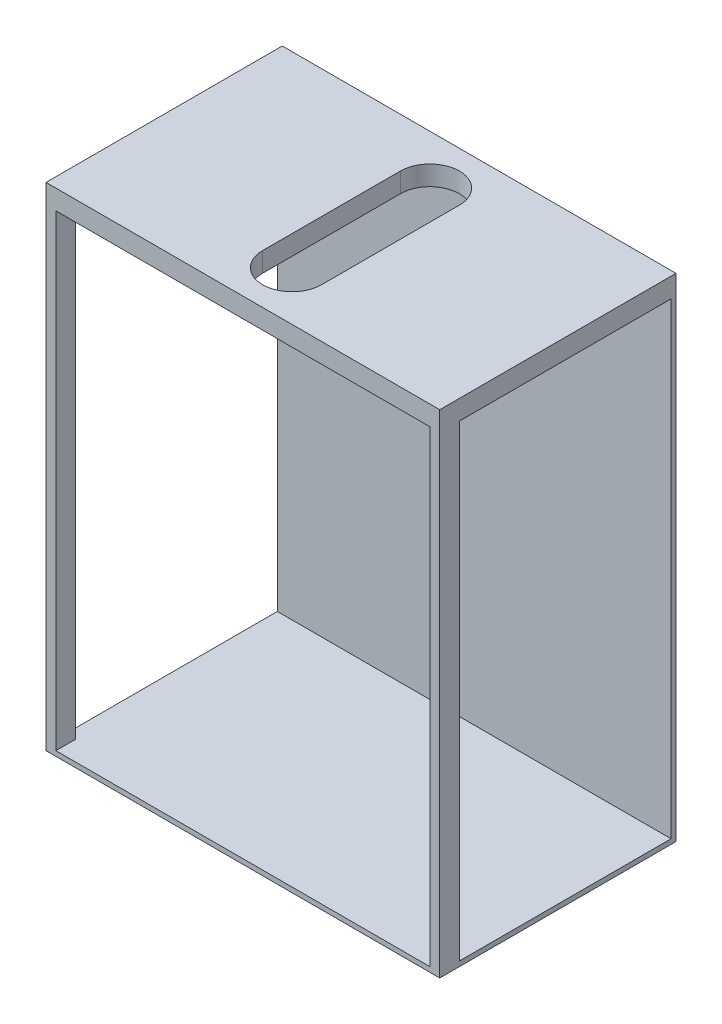
ISO-10303-21;
HEADER;
FILE_DESCRIPTION(('STEP AP214'),'2;1');
FILE_NAME('part.step','',(''),(''),'','','');
FILE_SCHEMA(('AUTOMOTIVE_DESIGN { 1 0 10303 214 1 1 1 1 }'));
ENDSEC;
DATA;
#1=APPLICATION_CONTEXT('core data for automotive mechanical design processes');
#2=APPLICATION_PROTOCOL_DEFINITION('international standard','automotive_design',2000,#1);
#3=PRODUCT_CONTEXT('',#1,'mechanical');
#4=PRODUCT('Part','Part','',(#3));
#5=PRODUCT_RELATED_PRODUCT_CATEGORY('part','',(#4));
#6=PRODUCT_DEFINITION_FORMATION('','',#4);
#7=PRODUCT_DEFINITION_CONTEXT('part definition',#1,'design');
#8=PRODUCT_DEFINITION('design','',#6,#7);
#9=PRODUCT_DEFINITION_SHAPE('','',#8);
#10=(LENGTH_UNIT() NAMED_UNIT(*) SI_UNIT(.MILLI.,.METRE.));
#11=(NAMED_UNIT(*) PLANE_ANGLE_UNIT() SI_UNIT($,.RADIAN.));
#12=(NAMED_UNIT(*) SI_UNIT($,.STERADIAN.) SOLID_ANGLE_UNIT());
#13=UNCERTAINTY_MEASURE_WITH_UNIT(LENGTH_MEASURE(1.E-05),#10,'distance_accuracy_value','');
#14=(GEOMETRIC_REPRESENTATION_CONTEXT(3) GLOBAL_UNCERTAINTY_ASSIGNED_CONTEXT((#13)) GLOBAL_UNIT_ASSIGNED_CONTEXT((#10,
#11,#12)) REPRESENTATION_CONTEXT('',''));
#15=CARTESIAN_POINT('',(0.,0.,0.));
#16=DIRECTION('',(0.,0.,1.));
#17=DIRECTION('',(1.,0.,0.));
#18=AXIS2_PLACEMENT_3D('',#15,#16,#17);
#19=CARTESIAN_POINT('',(0.,0.,6.35));
#20=DIRECTION('',(0.,0.,-1.));
#21=DIRECTION('',(-1.,0.,0.));
#22=AXIS2_PLACEMENT_3D('',#19,#20,#21);
#23=PLANE('',#22);
#24=DIRECTION('',(0.,1.,0.));
#25=VECTOR('',#24,1.);
#26=CARTESIAN_POINT('',(508.,0.,6.35));
#27=LINE('',#26,#25);
#28=CARTESIAN_POINT('',(508.,6.35,6.35));
#29=VERTEX_POINT('',#28);
#30=CARTESIAN_POINT('',(508.,609.6,6.35));
#31=VERTEX_POINT('',#30);
#32=EDGE_CURVE('E292',#29,#31,#27,.T.);
#33=ORIENTED_EDGE('',*,*,#32,.T.);
#34=DIRECTION('',(-1.,0.,0.));
#35=VECTOR('',#34,1.);
#36=CARTESIAN_POINT('',(12.7,609.6,6.35));
#37=LINE('',#36,#35);
#38=CARTESIAN_POINT('',(0.,609.6,6.35));
#39=VERTEX_POINT('',#38);
#40=EDGE_CURVE('E251',#31,#39,#37,.T.);
#41=ORIENTED_EDGE('',*,*,#40,.T.);
#42=DIRECTION('',(0.,-1.,0.));
#43=VECTOR('',#42,1.);
#44=CARTESIAN_POINT('',(0.,0.,6.35));
#45=LINE('',#44,#43);
#46=CARTESIAN_POINT('',(0.,6.35,6.35));
#47=VERTEX_POINT('',#46);
#48=EDGE_CURVE('E289',#39,#47,#45,.T.);
#49=ORIENTED_EDGE('',*,*,#48,.T.);
#50=DIRECTION('',(-1.,0.,0.));
#51=VECTOR('',#50,1.);
#52=CARTESIAN_POINT('',(0.,6.35,6.35));
#53=LINE('',#52,#51);
#54=EDGE_CURVE('E273',#29,#47,#53,.T.);
#55=ORIENTED_EDGE('',*,*,#54,.F.);
#56=EDGE_LOOP('',(#33,#41,#49,#55));
#57=FACE_BOUND('',#56,.T.);
#58=ADVANCED_FACE('F43',(#57),#23,.F.);
#59=CARTESIAN_POINT('',(12.7,0.,0.));
#60=DIRECTION('',(-1.,0.,0.));
#61=DIRECTION('',(0.,0.,1.));
#62=AXIS2_PLACEMENT_3D('',#59,#60,#61);
#63=PLANE('',#62);
#64=DIRECTION('',(0.,0.,-1.));
#65=VECTOR('',#64,1.);
#66=CARTESIAN_POINT('',(12.7,609.6,304.8));
#67=LINE('',#66,#65);
#68=CARTESIAN_POINT('',(12.7,609.6,304.8));
#69=VERTEX_POINT('',#68);
#70=CARTESIAN_POINT('',(12.7,609.6,279.4));
#71=VERTEX_POINT('',#70);
#72=EDGE_CURVE('E197',#69,#71,#67,.T.);
#73=ORIENTED_EDGE('',*,*,#72,.F.);
#74=DIRECTION('',(0.,-1.,0.));
#75=VECTOR('',#74,1.);
#76=CARTESIAN_POINT('',(12.7,6.35,304.8));
#77=LINE('',#76,#75);
#78=CARTESIAN_POINT('',(12.7,6.35,304.8));
#79=VERTEX_POINT('',#78);
#80=EDGE_CURVE('E239',#69,#79,#77,.T.);
#81=ORIENTED_EDGE('',*,*,#80,.T.);
#82=DIRECTION('',(0.,0.,-1.));
#83=VECTOR('',#82,1.);
#84=CARTESIAN_POINT('',(12.7,6.34999999999997,279.4));
#85=LINE('',#84,#83);
#86=CARTESIAN_POINT('',(12.7,6.35,279.4));
#87=VERTEX_POINT('',#86);
#88=EDGE_CURVE('E230',#79,#87,#85,.T.);
#89=ORIENTED_EDGE('',*,*,#88,.T.);
#90=DIRECTION('',(0.,1.,0.));
#91=VECTOR('',#90,1.);
#92=CARTESIAN_POINT('',(12.7,609.6,279.4));
#93=LINE('',#92,#91);
#94=EDGE_CURVE('E234',#87,#71,#93,.T.);
#95=ORIENTED_EDGE('',*,*,#94,.T.);
#96=EDGE_LOOP('',(#73,#81,#89,#95));
#97=FACE_BOUND('',#96,.T.);
#98=ADVANCED_FACE('F343',(#97),#63,.F.);
#99=CARTESIAN_POINT('',(495.3,0.,0.));
#100=DIRECTION('',(1.,0.,0.));
#101=DIRECTION('',(0.,0.,1.));
#102=AXIS2_PLACEMENT_3D('',#99,#100,#101);
#103=PLANE('',#102);
#104=DIRECTION('',(0.,0.,-1.));
#105=VECTOR('',#104,1.);
#106=CARTESIAN_POINT('',(495.3,609.6,304.8));
#107=LINE('',#106,#105);
#108=CARTESIAN_POINT('',(495.3,609.6,304.8));
#109=VERTEX_POINT('',#108);
#110=CARTESIAN_POINT('',(495.3,609.6,279.4));
#111=VERTEX_POINT('',#110);
#112=EDGE_CURVE('E200',#109,#111,#107,.T.);
#113=ORIENTED_EDGE('',*,*,#112,.T.);
#114=DIRECTION('',(0.,1.,0.));
#115=VECTOR('',#114,1.);
#116=CARTESIAN_POINT('',(495.3,609.6,279.4));
#117=LINE('',#116,#115);
#118=CARTESIAN_POINT('',(495.3,6.35,279.4));
#119=VERTEX_POINT('',#118);
#120=EDGE_CURVE('E213',#119,#111,#117,.T.);
#121=ORIENTED_EDGE('',*,*,#120,.F.);
#122=DIRECTION('',(0.,0.,-1.));
#123=VECTOR('',#122,1.);
#124=CARTESIAN_POINT('',(495.3,6.34999999999997,279.4));
#125=LINE('',#124,#123);
#126=CARTESIAN_POINT('',(495.3,6.35,304.8));
#127=VERTEX_POINT('',#126);
#128=EDGE_CURVE('E206',#127,#119,#125,.T.);
#129=ORIENTED_EDGE('',*,*,#128,.F.);
#130=DIRECTION('',(0.,-1.,0.));
#131=VECTOR('',#130,1.);
#132=CARTESIAN_POINT('',(495.3,6.35,304.8));
#133=LINE('',#132,#131);
#134=EDGE_CURVE('E209',#109,#127,#133,.T.);
#135=ORIENTED_EDGE('',*,*,#134,.F.);
#136=EDGE_LOOP('',(#113,#121,#129,#135));
#137=FACE_BOUND('',#136,.T.);
#138=ADVANCED_FACE('F349',(#137),#103,.F.);
#139=CARTESIAN_POINT('',(0.,6.35,0.));
#140=DIRECTION('',(0.,1.,0.));
#141=DIRECTION('',(0.,0.,1.));
#142=AXIS2_PLACEMENT_3D('',#139,#140,#141);
#143=PLANE('',#142);
#144=DIRECTION('',(1.,0.,0.));
#145=VECTOR('',#144,1.);
#146=CARTESIAN_POINT('',(495.3,6.34999999999997,279.4));
#147=LINE('',#146,#145);
#148=CARTESIAN_POINT('',(508.,6.35,279.4));
#149=VERTEX_POINT('',#148);
#150=EDGE_CURVE('E217',#119,#149,#147,.T.);
#151=ORIENTED_EDGE('',*,*,#150,.T.);
#152=DIRECTION('',(0.,0.,-1.));
#153=VECTOR('',#152,1.);
#154=CARTESIAN_POINT('',(508.,6.35,6.35));
#155=LINE('',#154,#153);
#156=EDGE_CURVE('E270',#149,#29,#155,.T.);
#157=ORIENTED_EDGE('',*,*,#156,.T.);
#158=ORIENTED_EDGE('',*,*,#54,.T.);
#159=DIRECTION('',(0.,0.,1.));
#160=VECTOR('',#159,1.);
#161=CARTESIAN_POINT('',(0.,6.35,6.35));
#162=LINE('',#161,#160);
#163=CARTESIAN_POINT('',(0.,6.35,279.4));
#164=VERTEX_POINT('',#163);
#165=EDGE_CURVE('E263',#47,#164,#162,.T.);
#166=ORIENTED_EDGE('',*,*,#165,.T.);
#167=DIRECTION('',(-1.,0.,0.));
#168=VECTOR('',#167,1.);
#169=CARTESIAN_POINT('',(12.7,6.34999999999997,279.4));
#170=LINE('',#169,#168);
#171=EDGE_CURVE('E258',#87,#164,#170,.T.);
#172=ORIENTED_EDGE('',*,*,#171,.F.);
#173=ORIENTED_EDGE('',*,*,#88,.F.);
#174=DIRECTION('',(1.,0.,0.));
#175=VECTOR('',#174,1.);
#176=CARTESIAN_POINT('',(0.,6.35,304.8));
#177=LINE('',#176,#175);
#178=EDGE_CURVE('E266',#79,#127,#177,.T.);
#179=ORIENTED_EDGE('',*,*,#178,.T.);
#180=ORIENTED_EDGE('',*,*,#128,.T.);
#181=EDGE_LOOP('',(#151,#157,#158,#166,#172,#173,#179,#180));
#182=FACE_BOUND('',#181,.T.);
#183=ADVANCED_FACE('F340',(#182),#143,.T.);
#184=CARTESIAN_POINT('',(0.,0.,6.35));
#185=DIRECTION('',(1.,0.,0.));
#186=DIRECTION('',(0.,0.,-1.));
#187=AXIS2_PLACEMENT_3D('',#184,#185,#186);
#188=PLANE('',#187);
#189=ORIENTED_EDGE('',*,*,#48,.F.);
#190=DIRECTION('',(0.,0.,-1.));
#191=VECTOR('',#190,1.);
#192=CARTESIAN_POINT('',(0.,609.6,6.35));
#193=LINE('',#192,#191);
#194=CARTESIAN_POINT('',(0.,609.6,279.4));
#195=VERTEX_POINT('',#194);
#196=EDGE_CURVE('E235',#195,#39,#193,.T.);
#197=ORIENTED_EDGE('',*,*,#196,.F.);
#198=DIRECTION('',(0.,1.,0.));
#199=VECTOR('',#198,1.);
#200=CARTESIAN_POINT('',(0.,609.6,279.4));
#201=LINE('',#200,#199);
#202=EDGE_CURVE('E229',#164,#195,#201,.T.);
#203=ORIENTED_EDGE('',*,*,#202,.F.);
#204=ORIENTED_EDGE('',*,*,#165,.F.);
#205=EDGE_LOOP('',(#189,#197,#203,#204));
#206=FACE_BOUND('',#205,.T.);
#207=DIRECTION('',(0.,-1.,0.));
#208=VECTOR('',#207,1.);
#209=CARTESIAN_POINT('',(0.,0.,0.));
#210=LINE('',#209,#208);
#211=CARTESIAN_POINT('',(0.,635.,0.));
#212=VERTEX_POINT('',#211);
#213=CARTESIAN_POINT('',(0.,0.,0.));
#214=VERTEX_POINT('',#213);
#215=EDGE_CURVE('E288',#212,#214,#210,.T.);
#216=ORIENTED_EDGE('',*,*,#215,.T.);
#217=DIRECTION('',(0.,0.,-1.));
#218=VECTOR('',#217,1.);
#219=CARTESIAN_POINT('',(0.,0.,6.35));
#220=LINE('',#219,#218);
#221=CARTESIAN_POINT('',(0.,0.,304.8));
#222=VERTEX_POINT('',#221);
#223=EDGE_CURVE('E11',#222,#214,#220,.T.);
#224=ORIENTED_EDGE('',*,*,#223,.F.);
#225=DIRECTION('',(0.,-1.,0.));
#226=VECTOR('',#225,1.);
#227=CARTESIAN_POINT('',(0.,6.35,304.8));
#228=LINE('',#227,#226);
#229=CARTESIAN_POINT('',(0.,635.,304.8));
#230=VERTEX_POINT('',#229);
#231=EDGE_CURVE('E284',#230,#222,#228,.T.);
#232=ORIENTED_EDGE('',*,*,#231,.F.);
#233=DIRECTION('',(0.,0.,-1.));
#234=VECTOR('',#233,1.);
#235=CARTESIAN_POINT('',(0.,635.,6.35));
#236=LINE('',#235,#234);
#237=EDGE_CURVE('E297',#230,#212,#236,.T.);
#238=ORIENTED_EDGE('',*,*,#237,.T.);
#239=EDGE_LOOP('',(#216,#224,#232,#238));
#240=FACE_BOUND('',#239,.T.);
#241=ADVANCED_FACE('F45',(#206,#240),#188,.F.);
#242=CARTESIAN_POINT('',(0.,0.,6.35));
#243=DIRECTION('',(0.,1.,0.));
#244=DIRECTION('',(0.,0.,1.));
#245=AXIS2_PLACEMENT_3D('',#242,#243,#244);
#246=PLANE('',#245);
#247=DIRECTION('',(1.,0.,0.));
#248=VECTOR('',#247,1.);
#249=CARTESIAN_POINT('',(0.,0.,0.));
#250=LINE('',#249,#248);
#251=CARTESIAN_POINT('',(508.,0.,0.));
#252=VERTEX_POINT('',#251);
#253=EDGE_CURVE('E301',#214,#252,#250,.T.);
#254=ORIENTED_EDGE('',*,*,#253,.T.);
#255=DIRECTION('',(0.,0.,-1.));
#256=VECTOR('',#255,1.);
#257=CARTESIAN_POINT('',(508.,0.,6.35));
#258=LINE('',#257,#256);
#259=CARTESIAN_POINT('',(508.,0.,304.8));
#260=VERTEX_POINT('',#259);
#261=EDGE_CURVE('E52',#260,#252,#258,.T.);
#262=ORIENTED_EDGE('',*,*,#261,.F.);
#263=DIRECTION('',(1.,0.,0.));
#264=VECTOR('',#263,1.);
#265=CARTESIAN_POINT('',(0.,0.,304.8));
#266=LINE('',#265,#264);
#267=EDGE_CURVE('E262',#222,#260,#266,.T.);
#268=ORIENTED_EDGE('',*,*,#267,.F.);
#269=ORIENTED_EDGE('',*,*,#223,.T.);
#270=EDGE_LOOP('',(#254,#262,#268,#269));
#271=FACE_BOUND('',#270,.T.);
#272=ADVANCED_FACE('F332',(#271),#246,.F.);
#273=CARTESIAN_POINT('',(508.,0.,6.35));
#274=DIRECTION('',(-1.,0.,0.));
#275=DIRECTION('',(0.,0.,1.));
#276=AXIS2_PLACEMENT_3D('',#273,#274,#275);
#277=PLANE('',#276);
#278=ORIENTED_EDGE('',*,*,#156,.F.);
#279=DIRECTION('',(0.,1.,0.));
#280=VECTOR('',#279,1.);
#281=CARTESIAN_POINT('',(508.,609.6,279.4));
#282=LINE('',#281,#280);
#283=CARTESIAN_POINT('',(508.,609.6,279.4));
#284=VERTEX_POINT('',#283);
#285=EDGE_CURVE('E210',#149,#284,#282,.T.);
#286=ORIENTED_EDGE('',*,*,#285,.T.);
#287=DIRECTION('',(0.,0.,-1.));
#288=VECTOR('',#287,1.);
#289=CARTESIAN_POINT('',(508.,609.6,6.35));
#290=LINE('',#289,#288);
#291=EDGE_CURVE('E203',#284,#31,#290,.T.);
#292=ORIENTED_EDGE('',*,*,#291,.T.);
#293=ORIENTED_EDGE('',*,*,#32,.F.);
#294=EDGE_LOOP('',(#278,#286,#292,#293));
#295=FACE_BOUND('',#294,.T.);
#296=DIRECTION('',(0.,1.,0.));
#297=VECTOR('',#296,1.);
#298=CARTESIAN_POINT('',(508.,0.,0.));
#299=LINE('',#298,#297);
#300=CARTESIAN_POINT('',(508.,635.,0.));
#301=VERTEX_POINT('',#300);
#302=EDGE_CURVE('E304',#252,#301,#299,.T.);
#303=ORIENTED_EDGE('',*,*,#302,.T.);
#304=DIRECTION('',(0.,0.,-1.));
#305=VECTOR('',#304,1.);
#306=CARTESIAN_POINT('',(508.,635.,6.35));
#307=LINE('',#306,#305);
#308=CARTESIAN_POINT('',(508.,635.,304.8));
#309=VERTEX_POINT('',#308);
#310=EDGE_CURVE('E312',#309,#301,#307,.T.);
#311=ORIENTED_EDGE('',*,*,#310,.F.);
#312=DIRECTION('',(0.,-1.,0.));
#313=VECTOR('',#312,1.);
#314=CARTESIAN_POINT('',(508.,6.35,304.8));
#315=LINE('',#314,#313);
#316=EDGE_CURVE('E277',#309,#260,#315,.T.);
#317=ORIENTED_EDGE('',*,*,#316,.T.);
#318=ORIENTED_EDGE('',*,*,#261,.T.);
#319=EDGE_LOOP('',(#303,#311,#317,#318));
#320=FACE_BOUND('',#319,.T.);
#321=ADVANCED_FACE('F319',(#295,#320),#277,.F.);
#322=CARTESIAN_POINT('',(0.,635.,6.35));
#323=DIRECTION('',(0.,-1.,0.));
#324=DIRECTION('',(0.,0.,-1.));
#325=AXIS2_PLACEMENT_3D('',#322,#323,#324);
#326=PLANE('',#325);
#327=DIRECTION('',(0.,0.,1.));
#328=VECTOR('',#327,1.);
#329=CARTESIAN_POINT('',(215.9,635.,63.5));
#330=LINE('',#329,#328);
#331=CARTESIAN_POINT('',(215.9,635.,63.5));
#332=VERTEX_POINT('',#331);
#333=CARTESIAN_POINT('',(215.9,635.,241.3));
#334=VERTEX_POINT('',#333);
#335=EDGE_CURVE('E170',#332,#334,#330,.T.);
#336=ORIENTED_EDGE('',*,*,#335,.F.);
#337=CARTESIAN_POINT('',(254.,635.,63.5));
#338=DIRECTION('',(0.,1.,0.));
#339=DIRECTION('',(0.,0.,1.));
#340=AXIS2_PLACEMENT_3D('',#337,#338,#339);
#341=CIRCLE('',#340,38.1000000000001);
#342=CARTESIAN_POINT('',(292.1,635.,63.5));
#343=VERTEX_POINT('',#342);
#344=EDGE_CURVE('E59',#343,#332,#341,.T.);
#345=ORIENTED_EDGE('',*,*,#344,.F.);
#346=DIRECTION('',(0.,0.,-1.));
#347=VECTOR('',#346,1.);
#348=CARTESIAN_POINT('',(292.1,635.,63.5));
#349=LINE('',#348,#347);
#350=CARTESIAN_POINT('',(292.1,635.,241.3));
#351=VERTEX_POINT('',#350);
#352=EDGE_CURVE('E178',#351,#343,#349,.T.);
#353=ORIENTED_EDGE('',*,*,#352,.F.);
#354=CARTESIAN_POINT('',(254.,635.,241.3));
#355=DIRECTION('',(0.,1.,0.));
#356=DIRECTION('',(0.,0.,1.));
#357=AXIS2_PLACEMENT_3D('',#354,#355,#356);
#358=CIRCLE('',#357,38.1000000000001);
#359=EDGE_CURVE('E160',#334,#351,#358,.T.);
#360=ORIENTED_EDGE('',*,*,#359,.F.);
#361=EDGE_LOOP('',(#336,#345,#353,#360));
#362=FACE_BOUND('',#361,.T.);
#363=DIRECTION('',(-1.,0.,0.));
#364=VECTOR('',#363,1.);
#365=CARTESIAN_POINT('',(12.7,635.,304.8));
#366=LINE('',#365,#364);
#367=EDGE_CURVE('E242',#309,#230,#366,.T.);
#368=ORIENTED_EDGE('',*,*,#367,.F.);
#369=ORIENTED_EDGE('',*,*,#310,.T.);
#370=DIRECTION('',(-1.,0.,0.));
#371=VECTOR('',#370,1.);
#372=CARTESIAN_POINT('',(0.,635.,0.));
#373=LINE('',#372,#371);
#374=EDGE_CURVE('E293',#301,#212,#373,.T.);
#375=ORIENTED_EDGE('',*,*,#374,.T.);
#376=ORIENTED_EDGE('',*,*,#237,.F.);
#377=EDGE_LOOP('',(#368,#369,#375,#376));
#378=FACE_BOUND('',#377,.T.);
#379=ADVANCED_FACE('F175',(#362,#378),#326,.F.);
#380=CARTESIAN_POINT('',(0.,0.,0.));
#381=DIRECTION('',(0.,0.,-1.));
#382=DIRECTION('',(-1.,0.,0.));
#383=AXIS2_PLACEMENT_3D('',#380,#381,#382);
#384=PLANE('',#383);
#385=ORIENTED_EDGE('',*,*,#215,.F.);
#386=ORIENTED_EDGE('',*,*,#374,.F.);
#387=ORIENTED_EDGE('',*,*,#302,.F.);
#388=ORIENTED_EDGE('',*,*,#253,.F.);
#389=EDGE_LOOP('',(#385,#386,#387,#388));
#390=FACE_BOUND('',#389,.T.);
#391=ADVANCED_FACE('F327',(#390),#384,.T.);
#392=CARTESIAN_POINT('',(0.,6.35,304.8));
#393=DIRECTION('',(0.,0.,-1.));
#394=DIRECTION('',(-1.,0.,0.));
#395=AXIS2_PLACEMENT_3D('',#392,#393,#394);
#396=PLANE('',#395);
#397=ORIENTED_EDGE('',*,*,#80,.F.);
#398=DIRECTION('',(-1.,0.,0.));
#399=VECTOR('',#398,1.);
#400=CARTESIAN_POINT('',(794.828900942797,609.6,304.8));
#401=LINE('',#400,#399);
#402=EDGE_CURVE('E195',#109,#69,#401,.T.);
#403=ORIENTED_EDGE('',*,*,#402,.F.);
#404=ORIENTED_EDGE('',*,*,#134,.T.);
#405=ORIENTED_EDGE('',*,*,#178,.F.);
#406=EDGE_LOOP('',(#397,#403,#404,#405));
#407=FACE_BOUND('',#406,.T.);
#408=ORIENTED_EDGE('',*,*,#267,.T.);
#409=ORIENTED_EDGE('',*,*,#316,.F.);
#410=ORIENTED_EDGE('',*,*,#367,.T.);
#411=ORIENTED_EDGE('',*,*,#231,.T.);
#412=EDGE_LOOP('',(#408,#409,#410,#411));
#413=FACE_BOUND('',#412,.T.);
#414=ADVANCED_FACE('F331',(#407,#413),#396,.F.);
#415=CARTESIAN_POINT('',(12.7,609.6,279.4));
#416=DIRECTION('',(0.,0.,1.));
#417=DIRECTION('',(0.,-1.,0.));
#418=AXIS2_PLACEMENT_3D('',#415,#416,#417);
#419=PLANE('',#418);
#420=ORIENTED_EDGE('',*,*,#202,.T.);
#421=DIRECTION('',(-1.,0.,0.));
#422=VECTOR('',#421,1.);
#423=CARTESIAN_POINT('',(12.7,609.6,279.4));
#424=LINE('',#423,#422);
#425=EDGE_CURVE('E254',#71,#195,#424,.T.);
#426=ORIENTED_EDGE('',*,*,#425,.F.);
#427=ORIENTED_EDGE('',*,*,#94,.F.);
#428=ORIENTED_EDGE('',*,*,#171,.T.);
#429=EDGE_LOOP('',(#420,#426,#427,#428));
#430=FACE_BOUND('',#429,.T.);
#431=ADVANCED_FACE('F374',(#430),#419,.F.);
#432=CARTESIAN_POINT('',(12.7,609.6,6.35));
#433=DIRECTION('',(0.,1.,0.));
#434=DIRECTION('',(0.,0.,1.));
#435=AXIS2_PLACEMENT_3D('',#432,#433,#434);
#436=PLANE('',#435);
#437=DIRECTION('',(0.,0.,1.));
#438=VECTOR('',#437,1.);
#439=CARTESIAN_POINT('',(292.1,609.6,63.5));
#440=LINE('',#439,#438);
#441=CARTESIAN_POINT('',(292.1,609.6,63.5));
#442=VERTEX_POINT('',#441);
#443=CARTESIAN_POINT('',(292.1,609.6,241.3));
#444=VERTEX_POINT('',#443);
#445=EDGE_CURVE('E583',#442,#444,#440,.T.);
#446=ORIENTED_EDGE('',*,*,#445,.F.);
#447=CARTESIAN_POINT('',(254.,609.6,63.5));
#448=DIRECTION('',(0.,1.,0.));
#449=DIRECTION('',(0.,0.,1.));
#450=AXIS2_PLACEMENT_3D('',#447,#448,#449);
#451=CIRCLE('',#450,38.1000000000001);
#452=CARTESIAN_POINT('',(215.9,609.6,63.5));
#453=VERTEX_POINT('',#452);
#454=EDGE_CURVE('E196',#453,#442,#451,.F.);
#455=ORIENTED_EDGE('',*,*,#454,.F.);
#456=DIRECTION('',(0.,0.,-1.));
#457=VECTOR('',#456,1.);
#458=CARTESIAN_POINT('',(215.9,609.6,63.5));
#459=LINE('',#458,#457);
#460=CARTESIAN_POINT('',(215.9,609.6,241.3));
#461=VERTEX_POINT('',#460);
#462=EDGE_CURVE('E192',#461,#453,#459,.T.);
#463=ORIENTED_EDGE('',*,*,#462,.F.);
#464=CARTESIAN_POINT('',(254.,609.6,241.3));
#465=DIRECTION('',(0.,1.,0.));
#466=DIRECTION('',(0.,0.,1.));
#467=AXIS2_PLACEMENT_3D('',#464,#465,#466);
#468=CIRCLE('',#467,38.1000000000001);
#469=EDGE_CURVE('E163',#444,#461,#468,.F.);
#470=ORIENTED_EDGE('',*,*,#469,.F.);
#471=EDGE_LOOP('',(#446,#455,#463,#470));
#472=FACE_BOUND('',#471,.T.);
#473=ORIENTED_EDGE('',*,*,#196,.T.);
#474=ORIENTED_EDGE('',*,*,#40,.F.);
#475=ORIENTED_EDGE('',*,*,#291,.F.);
#476=DIRECTION('',(1.,0.,0.));
#477=VECTOR('',#476,1.);
#478=CARTESIAN_POINT('',(495.3,609.6,279.4));
#479=LINE('',#478,#477);
#480=EDGE_CURVE('E226',#111,#284,#479,.T.);
#481=ORIENTED_EDGE('',*,*,#480,.F.);
#482=ORIENTED_EDGE('',*,*,#112,.F.);
#483=ORIENTED_EDGE('',*,*,#402,.T.);
#484=ORIENTED_EDGE('',*,*,#72,.T.);
#485=ORIENTED_EDGE('',*,*,#425,.T.);
#486=EDGE_LOOP('',(#473,#474,#475,#481,#482,#483,#484,#485));
#487=FACE_BOUND('',#486,.T.);
#488=ADVANCED_FACE('F382',(#472,#487),#436,.F.);
#489=CARTESIAN_POINT('',(495.3,609.6,279.4));
#490=DIRECTION('',(0.,0.,-1.));
#491=DIRECTION('',(0.,1.,0.));
#492=AXIS2_PLACEMENT_3D('',#489,#490,#491);
#493=PLANE('',#492);
#494=ORIENTED_EDGE('',*,*,#285,.F.);
#495=ORIENTED_EDGE('',*,*,#150,.F.);
#496=ORIENTED_EDGE('',*,*,#120,.T.);
#497=ORIENTED_EDGE('',*,*,#480,.T.);
#498=EDGE_LOOP('',(#494,#495,#496,#497));
#499=FACE_BOUND('',#498,.T.);
#500=ADVANCED_FACE('F389',(#499),#493,.T.);
#501=CARTESIAN_POINT('',(254.,344.416214673672,63.5));
#502=DIRECTION('',(0.,1.,0.));
#503=DIRECTION('',(0.,0.,1.));
#504=AXIS2_PLACEMENT_3D('',#501,#502,#503);
#505=CYLINDRICAL_SURFACE('',#504,38.1000000000001);
#506=ORIENTED_EDGE('',*,*,#454,.T.);
#507=DIRECTION('',(0.,1.,0.));
#508=VECTOR('',#507,1.);
#509=CARTESIAN_POINT('',(292.1,344.416214673672,63.5));
#510=LINE('',#509,#508);
#511=EDGE_CURVE('E185',#442,#343,#510,.T.);
#512=ORIENTED_EDGE('',*,*,#511,.T.);
#513=ORIENTED_EDGE('',*,*,#344,.T.);
#514=DIRECTION('',(0.,1.,0.));
#515=VECTOR('',#514,1.);
#516=CARTESIAN_POINT('',(215.9,344.416214673672,63.5));
#517=LINE('',#516,#515);
#518=EDGE_CURVE('E167',#453,#332,#517,.T.);
#519=ORIENTED_EDGE('',*,*,#518,.F.);
#520=EDGE_LOOP('',(#506,#512,#513,#519));
#521=FACE_BOUND('',#520,.T.);
#522=ADVANCED_FACE('F397',(#521),#505,.F.);
#523=CARTESIAN_POINT('',(292.1,344.416214673672,63.5));
#524=DIRECTION('',(1.,0.,0.));
#525=DIRECTION('',(0.,0.,-1.));
#526=AXIS2_PLACEMENT_3D('',#523,#524,#525);
#527=PLANE('',#526);
#528=ORIENTED_EDGE('',*,*,#445,.T.);
#529=DIRECTION('',(0.,1.,0.));
#530=VECTOR('',#529,1.);
#531=CARTESIAN_POINT('',(292.1,344.416214673672,241.3));
#532=LINE('',#531,#530);
#533=EDGE_CURVE('E166',#444,#351,#532,.T.);
#534=ORIENTED_EDGE('',*,*,#533,.T.);
#535=ORIENTED_EDGE('',*,*,#352,.T.);
#536=ORIENTED_EDGE('',*,*,#511,.F.);
#537=EDGE_LOOP('',(#528,#534,#535,#536));
#538=FACE_BOUND('',#537,.T.);
#539=ADVANCED_FACE('F404',(#538),#527,.F.);
#540=CARTESIAN_POINT('',(254.,344.416214673672,241.3));
#541=DIRECTION('',(0.,1.,0.));
#542=DIRECTION('',(0.,0.,1.));
#543=AXIS2_PLACEMENT_3D('',#540,#541,#542);
#544=CYLINDRICAL_SURFACE('',#543,38.1000000000001);
#545=ORIENTED_EDGE('',*,*,#469,.T.);
#546=DIRECTION('',(0.,1.,0.));
#547=VECTOR('',#546,1.);
#548=CARTESIAN_POINT('',(215.9,344.416214673672,241.3));
#549=LINE('',#548,#547);
#550=EDGE_CURVE('E67',#461,#334,#549,.T.);
#551=ORIENTED_EDGE('',*,*,#550,.T.);
#552=ORIENTED_EDGE('',*,*,#359,.T.);
#553=ORIENTED_EDGE('',*,*,#533,.F.);
#554=EDGE_LOOP('',(#545,#551,#552,#553));
#555=FACE_BOUND('',#554,.T.);
#556=ADVANCED_FACE('F157',(#555),#544,.F.);
#557=CARTESIAN_POINT('',(215.9,344.416214673672,63.5));
#558=DIRECTION('',(-1.,0.,0.));
#559=DIRECTION('',(0.,0.,1.));
#560=AXIS2_PLACEMENT_3D('',#557,#558,#559);
#561=PLANE('',#560);
#562=ORIENTED_EDGE('',*,*,#462,.T.);
#563=ORIENTED_EDGE('',*,*,#518,.T.);
#564=ORIENTED_EDGE('',*,*,#335,.T.);
#565=ORIENTED_EDGE('',*,*,#550,.F.);
#566=EDGE_LOOP('',(#562,#563,#564,#565));
#567=FACE_BOUND('',#566,.T.);
#568=ADVANCED_FACE('F171',(#567),#561,.F.);
#569=CLOSED_SHELL('',(#58,#98,#138,#183,#241,#272,#321,#379,#391,#414,#431,#488,#500,#522,#539,
#556,#568));
#570=MANIFOLD_SOLID_BREP('B2',#569);
#571=ADVANCED_BREP_SHAPE_REPRESENTATION('',(#18,#570),#14);
#572=SHAPE_DEFINITION_REPRESENTATION(#9,#571);
ENDSEC;
END-ISO-10303-21;
